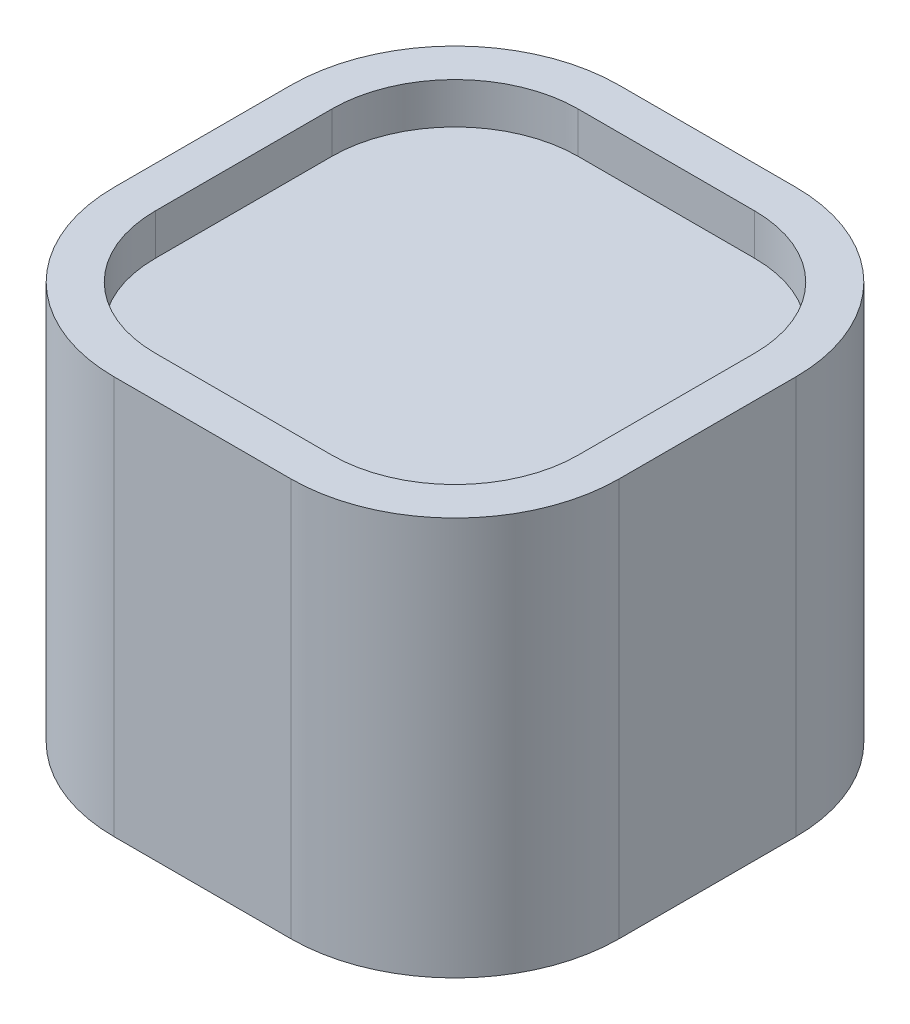
ISO-10303-21;
HEADER;
FILE_DESCRIPTION(('STEP AP214'),'2;1');
FILE_NAME('part.step','',(''),(''),'','','');
FILE_SCHEMA(('AUTOMOTIVE_DESIGN { 1 0 10303 214 1 1 1 1 }'));
ENDSEC;
DATA;
#1=APPLICATION_CONTEXT('core data for automotive mechanical design processes');
#2=APPLICATION_PROTOCOL_DEFINITION('international standard','automotive_design',2000,#1);
#3=PRODUCT_CONTEXT('',#1,'mechanical');
#4=PRODUCT('Part','Part','',(#3));
#5=PRODUCT_RELATED_PRODUCT_CATEGORY('part','',(#4));
#6=PRODUCT_DEFINITION_FORMATION('','',#4);
#7=PRODUCT_DEFINITION_CONTEXT('part definition',#1,'design');
#8=PRODUCT_DEFINITION('design','',#6,#7);
#9=PRODUCT_DEFINITION_SHAPE('','',#8);
#10=(LENGTH_UNIT() NAMED_UNIT(*) SI_UNIT(.MILLI.,.METRE.));
#11=(NAMED_UNIT(*) PLANE_ANGLE_UNIT() SI_UNIT($,.RADIAN.));
#12=(NAMED_UNIT(*) SI_UNIT($,.STERADIAN.) SOLID_ANGLE_UNIT());
#13=UNCERTAINTY_MEASURE_WITH_UNIT(LENGTH_MEASURE(1.E-05),#10,'distance_accuracy_value','');
#14=(GEOMETRIC_REPRESENTATION_CONTEXT(3) GLOBAL_UNCERTAINTY_ASSIGNED_CONTEXT((#13)) GLOBAL_UNIT_ASSIGNED_CONTEXT((#10,
#11,#12)) REPRESENTATION_CONTEXT('',''));
#15=CARTESIAN_POINT('',(0.,0.,0.));
#16=DIRECTION('',(0.,0.,1.));
#17=DIRECTION('',(1.,0.,0.));
#18=AXIS2_PLACEMENT_3D('',#15,#16,#17);
#19=CARTESIAN_POINT('',(-21.5,97.,21.5));
#20=DIRECTION('',(0.,1.,0.));
#21=DIRECTION('',(0.,0.,1.));
#22=AXIS2_PLACEMENT_3D('',#19,#20,#21);
#23=CYLINDRICAL_SURFACE('',#22,40.);
#24=DIRECTION('',(0.,1.,0.));
#25=VECTOR('',#24,1.);
#26=CARTESIAN_POINT('',(-61.5,97.,21.5));
#27=LINE('',#26,#25);
#28=CARTESIAN_POINT('',(-61.5,0.,21.5));
#29=VERTEX_POINT('',#28);
#30=CARTESIAN_POINT('',(-61.5,97.,21.5));
#31=VERTEX_POINT('',#30);
#32=EDGE_CURVE('E268',#29,#31,#27,.T.);
#33=ORIENTED_EDGE('',*,*,#32,.F.);
#34=CARTESIAN_POINT('',(-21.5,0.,21.5));
#35=DIRECTION('',(0.,1.,0.));
#36=DIRECTION('',(0.,0.,1.));
#37=AXIS2_PLACEMENT_3D('',#34,#35,#36);
#38=CIRCLE('',#37,40.);
#39=CARTESIAN_POINT('',(-21.5,0.,61.5));
#40=VERTEX_POINT('',#39);
#41=EDGE_CURVE('E45',#40,#29,#38,.F.);
#42=ORIENTED_EDGE('',*,*,#41,.F.);
#43=DIRECTION('',(0.,1.,0.));
#44=VECTOR('',#43,1.);
#45=CARTESIAN_POINT('',(-21.5,97.,61.5));
#46=LINE('',#45,#44);
#47=CARTESIAN_POINT('',(-21.5,97.,61.5));
#48=VERTEX_POINT('',#47);
#49=EDGE_CURVE('E271',#48,#40,#46,.F.);
#50=ORIENTED_EDGE('',*,*,#49,.F.);
#51=CARTESIAN_POINT('',(-21.5,97.,21.5));
#52=DIRECTION('',(0.,1.,0.));
#53=DIRECTION('',(0.,0.,1.));
#54=AXIS2_PLACEMENT_3D('',#51,#52,#53);
#55=CIRCLE('',#54,40.);
#56=EDGE_CURVE('E11',#31,#48,#55,.T.);
#57=ORIENTED_EDGE('',*,*,#56,.F.);
#58=EDGE_LOOP('',(#33,#42,#50,#57));
#59=FACE_BOUND('',#58,.T.);
#60=ADVANCED_FACE('F38',(#59),#23,.T.);
#61=CARTESIAN_POINT('',(21.5,97.,21.5));
#62=DIRECTION('',(0.,-1.,0.));
#63=DIRECTION('',(0.,0.,-1.));
#64=AXIS2_PLACEMENT_3D('',#61,#62,#63);
#65=CYLINDRICAL_SURFACE('',#64,40.);
#66=DIRECTION('',(0.,-1.,0.));
#67=VECTOR('',#66,1.);
#68=CARTESIAN_POINT('',(61.5,97.,21.5));
#69=LINE('',#68,#67);
#70=CARTESIAN_POINT('',(61.5,97.,21.5));
#71=VERTEX_POINT('',#70);
#72=CARTESIAN_POINT('',(61.5,0.,21.5));
#73=VERTEX_POINT('',#72);
#74=EDGE_CURVE('E257',#71,#73,#69,.T.);
#75=ORIENTED_EDGE('',*,*,#74,.F.);
#76=CARTESIAN_POINT('',(21.5,97.,21.5));
#77=DIRECTION('',(0.,1.,0.));
#78=DIRECTION('',(0.,0.,1.));
#79=AXIS2_PLACEMENT_3D('',#76,#77,#78);
#80=CIRCLE('',#79,40.);
#81=CARTESIAN_POINT('',(21.5,97.,61.5));
#82=VERTEX_POINT('',#81);
#83=EDGE_CURVE('E263',#82,#71,#80,.T.);
#84=ORIENTED_EDGE('',*,*,#83,.F.);
#85=DIRECTION('',(0.,-1.,0.));
#86=VECTOR('',#85,1.);
#87=CARTESIAN_POINT('',(21.5,97.,61.5));
#88=LINE('',#87,#86);
#89=CARTESIAN_POINT('',(21.5,0.,61.5));
#90=VERTEX_POINT('',#89);
#91=EDGE_CURVE('E260',#90,#82,#88,.F.);
#92=ORIENTED_EDGE('',*,*,#91,.F.);
#93=CARTESIAN_POINT('',(21.5,0.,21.5));
#94=DIRECTION('',(0.,1.,0.));
#95=DIRECTION('',(0.,0.,1.));
#96=AXIS2_PLACEMENT_3D('',#93,#94,#95);
#97=CIRCLE('',#96,40.);
#98=EDGE_CURVE('E265',#73,#90,#97,.F.);
#99=ORIENTED_EDGE('',*,*,#98,.F.);
#100=EDGE_LOOP('',(#75,#84,#92,#99));
#101=FACE_BOUND('',#100,.T.);
#102=ADVANCED_FACE('F304',(#101),#65,.T.);
#103=CARTESIAN_POINT('',(21.5,97.,-21.5));
#104=DIRECTION('',(0.,-1.,0.));
#105=DIRECTION('',(0.,0.,-1.));
#106=AXIS2_PLACEMENT_3D('',#103,#104,#105);
#107=CYLINDRICAL_SURFACE('',#106,40.);
#108=DIRECTION('',(0.,-1.,0.));
#109=VECTOR('',#108,1.);
#110=CARTESIAN_POINT('',(21.5,97.,-61.5));
#111=LINE('',#110,#109);
#112=CARTESIAN_POINT('',(21.5,97.,-61.5));
#113=VERTEX_POINT('',#112);
#114=CARTESIAN_POINT('',(21.5,0.,-61.5));
#115=VERTEX_POINT('',#114);
#116=EDGE_CURVE('E246',#113,#115,#111,.T.);
#117=ORIENTED_EDGE('',*,*,#116,.F.);
#118=CARTESIAN_POINT('',(21.5,97.,-21.5));
#119=DIRECTION('',(0.,1.,0.));
#120=DIRECTION('',(0.,0.,1.));
#121=AXIS2_PLACEMENT_3D('',#118,#119,#120);
#122=CIRCLE('',#121,40.);
#123=CARTESIAN_POINT('',(61.5,97.,-21.5));
#124=VERTEX_POINT('',#123);
#125=EDGE_CURVE('E252',#124,#113,#122,.T.);
#126=ORIENTED_EDGE('',*,*,#125,.F.);
#127=DIRECTION('',(0.,-1.,0.));
#128=VECTOR('',#127,1.);
#129=CARTESIAN_POINT('',(61.5,97.,-21.5));
#130=LINE('',#129,#128);
#131=CARTESIAN_POINT('',(61.5,0.,-21.5));
#132=VERTEX_POINT('',#131);
#133=EDGE_CURVE('E249',#132,#124,#130,.F.);
#134=ORIENTED_EDGE('',*,*,#133,.F.);
#135=CARTESIAN_POINT('',(21.5,0.,-21.5));
#136=DIRECTION('',(0.,1.,0.));
#137=DIRECTION('',(0.,0.,1.));
#138=AXIS2_PLACEMENT_3D('',#135,#136,#137);
#139=CIRCLE('',#138,40.);
#140=EDGE_CURVE('E254',#115,#132,#139,.F.);
#141=ORIENTED_EDGE('',*,*,#140,.F.);
#142=EDGE_LOOP('',(#117,#126,#134,#141));
#143=FACE_BOUND('',#142,.T.);
#144=ADVANCED_FACE('F296',(#143),#107,.T.);
#145=CARTESIAN_POINT('',(-21.5,97.,-21.5));
#146=DIRECTION('',(0.,-1.,0.));
#147=DIRECTION('',(0.,0.,-1.));
#148=AXIS2_PLACEMENT_3D('',#145,#146,#147);
#149=CYLINDRICAL_SURFACE('',#148,40.);
#150=DIRECTION('',(0.,-1.,0.));
#151=VECTOR('',#150,1.);
#152=CARTESIAN_POINT('',(-61.5,97.,-21.5));
#153=LINE('',#152,#151);
#154=CARTESIAN_POINT('',(-61.5,97.,-21.5));
#155=VERTEX_POINT('',#154);
#156=CARTESIAN_POINT('',(-61.5,0.,-21.5));
#157=VERTEX_POINT('',#156);
#158=EDGE_CURVE('E228',#155,#157,#153,.T.);
#159=ORIENTED_EDGE('',*,*,#158,.F.);
#160=CARTESIAN_POINT('',(-21.5,97.,-21.5));
#161=DIRECTION('',(0.,1.,0.));
#162=DIRECTION('',(0.,0.,1.));
#163=AXIS2_PLACEMENT_3D('',#160,#161,#162);
#164=CIRCLE('',#163,40.);
#165=CARTESIAN_POINT('',(-21.5,97.,-61.5));
#166=VERTEX_POINT('',#165);
#167=EDGE_CURVE('E241',#166,#155,#164,.T.);
#168=ORIENTED_EDGE('',*,*,#167,.F.);
#169=DIRECTION('',(0.,-1.,0.));
#170=VECTOR('',#169,1.);
#171=CARTESIAN_POINT('',(-21.5,97.,-61.5));
#172=LINE('',#171,#170);
#173=CARTESIAN_POINT('',(-21.5,0.,-61.5));
#174=VERTEX_POINT('',#173);
#175=EDGE_CURVE('E238',#174,#166,#172,.F.);
#176=ORIENTED_EDGE('',*,*,#175,.F.);
#177=CARTESIAN_POINT('',(-21.5,0.,-21.5));
#178=DIRECTION('',(0.,1.,0.));
#179=DIRECTION('',(0.,0.,1.));
#180=AXIS2_PLACEMENT_3D('',#177,#178,#179);
#181=CIRCLE('',#180,40.);
#182=EDGE_CURVE('E243',#157,#174,#181,.F.);
#183=ORIENTED_EDGE('',*,*,#182,.F.);
#184=EDGE_LOOP('',(#159,#168,#176,#183));
#185=FACE_BOUND('',#184,.T.);
#186=ADVANCED_FACE('F285',(#185),#149,.T.);
#187=CARTESIAN_POINT('',(61.5,97.,-61.5));
#188=DIRECTION('',(-1.,0.,0.));
#189=DIRECTION('',(0.,0.,1.));
#190=AXIS2_PLACEMENT_3D('',#187,#188,#189);
#191=PLANE('',#190);
#192=DIRECTION('',(0.,0.,-1.));
#193=VECTOR('',#192,1.);
#194=CARTESIAN_POINT('',(61.5,97.,-61.5));
#195=LINE('',#194,#193);
#196=EDGE_CURVE('E219',#71,#124,#195,.T.);
#197=ORIENTED_EDGE('',*,*,#196,.F.);
#198=ORIENTED_EDGE('',*,*,#74,.T.);
#199=DIRECTION('',(0.,0.,-1.));
#200=VECTOR('',#199,1.);
#201=CARTESIAN_POINT('',(61.5,0.,-61.5));
#202=LINE('',#201,#200);
#203=EDGE_CURVE('E207',#73,#132,#202,.T.);
#204=ORIENTED_EDGE('',*,*,#203,.T.);
#205=ORIENTED_EDGE('',*,*,#133,.T.);
#206=EDGE_LOOP('',(#197,#198,#204,#205));
#207=FACE_BOUND('',#206,.T.);
#208=ADVANCED_FACE('F299',(#207),#191,.F.);
#209=CARTESIAN_POINT('',(-61.5,97.,-61.5));
#210=DIRECTION('',(0.,0.,1.));
#211=DIRECTION('',(1.,0.,0.));
#212=AXIS2_PLACEMENT_3D('',#209,#210,#211);
#213=PLANE('',#212);
#214=DIRECTION('',(-1.,0.,0.));
#215=VECTOR('',#214,1.);
#216=CARTESIAN_POINT('',(-61.5,97.,-61.5));
#217=LINE('',#216,#215);
#218=EDGE_CURVE('E221',#113,#166,#217,.T.);
#219=ORIENTED_EDGE('',*,*,#218,.F.);
#220=ORIENTED_EDGE('',*,*,#116,.T.);
#221=DIRECTION('',(-1.,0.,0.));
#222=VECTOR('',#221,1.);
#223=CARTESIAN_POINT('',(-61.5,0.,-61.5));
#224=LINE('',#223,#222);
#225=EDGE_CURVE('E230',#115,#174,#224,.T.);
#226=ORIENTED_EDGE('',*,*,#225,.T.);
#227=ORIENTED_EDGE('',*,*,#175,.T.);
#228=EDGE_LOOP('',(#219,#220,#226,#227));
#229=FACE_BOUND('',#228,.T.);
#230=ADVANCED_FACE('F292',(#229),#213,.F.);
#231=CARTESIAN_POINT('',(-61.5,97.,-61.5));
#232=DIRECTION('',(1.,0.,0.));
#233=DIRECTION('',(0.,0.,-1.));
#234=AXIS2_PLACEMENT_3D('',#231,#232,#233);
#235=PLANE('',#234);
#236=DIRECTION('',(0.,0.,1.));
#237=VECTOR('',#236,1.);
#238=CARTESIAN_POINT('',(-61.5,0.,-61.5));
#239=LINE('',#238,#237);
#240=EDGE_CURVE('E232',#157,#29,#239,.T.);
#241=ORIENTED_EDGE('',*,*,#240,.T.);
#242=ORIENTED_EDGE('',*,*,#32,.T.);
#243=DIRECTION('',(0.,0.,1.));
#244=VECTOR('',#243,1.);
#245=CARTESIAN_POINT('',(-61.5,97.,-61.5));
#246=LINE('',#245,#244);
#247=EDGE_CURVE('E224',#155,#31,#246,.T.);
#248=ORIENTED_EDGE('',*,*,#247,.F.);
#249=ORIENTED_EDGE('',*,*,#158,.T.);
#250=EDGE_LOOP('',(#241,#242,#248,#249));
#251=FACE_BOUND('',#250,.T.);
#252=ADVANCED_FACE('F281',(#251),#235,.F.);
#253=CARTESIAN_POINT('',(-61.5,97.,61.5));
#254=DIRECTION('',(0.,0.,-1.));
#255=DIRECTION('',(-1.,0.,0.));
#256=AXIS2_PLACEMENT_3D('',#253,#254,#255);
#257=PLANE('',#256);
#258=DIRECTION('',(1.,0.,0.));
#259=VECTOR('',#258,1.);
#260=CARTESIAN_POINT('',(-61.5,97.,61.5));
#261=LINE('',#260,#259);
#262=EDGE_CURVE('E226',#48,#82,#261,.T.);
#263=ORIENTED_EDGE('',*,*,#262,.F.);
#264=ORIENTED_EDGE('',*,*,#49,.T.);
#265=DIRECTION('',(1.,0.,0.));
#266=VECTOR('',#265,1.);
#267=CARTESIAN_POINT('',(-61.5,0.,61.5));
#268=LINE('',#267,#266);
#269=EDGE_CURVE('E222',#40,#90,#268,.T.);
#270=ORIENTED_EDGE('',*,*,#269,.T.);
#271=ORIENTED_EDGE('',*,*,#91,.T.);
#272=EDGE_LOOP('',(#263,#264,#270,#271));
#273=FACE_BOUND('',#272,.T.);
#274=ADVANCED_FACE('F307',(#273),#257,.F.);
#275=CARTESIAN_POINT('',(0.,97.,0.));
#276=DIRECTION('',(0.,1.,0.));
#277=DIRECTION('',(0.,0.,1.));
#278=AXIS2_PLACEMENT_3D('',#275,#276,#277);
#279=PLANE('',#278);
#280=DIRECTION('',(-1.,0.,0.));
#281=VECTOR('',#280,1.);
#282=CARTESIAN_POINT('',(0.,97.,-51.5));
#283=LINE('',#282,#281);
#284=CARTESIAN_POINT('',(21.5,97.,-51.5));
#285=VERTEX_POINT('',#284);
#286=CARTESIAN_POINT('',(-21.5,97.,-51.5));
#287=VERTEX_POINT('',#286);
#288=EDGE_CURVE('E52',#285,#287,#283,.T.);
#289=ORIENTED_EDGE('',*,*,#288,.F.);
#290=CARTESIAN_POINT('',(21.5,97.,-21.5));
#291=DIRECTION('',(0.,1.,0.));
#292=DIRECTION('',(0.,0.,1.));
#293=AXIS2_PLACEMENT_3D('',#290,#291,#292);
#294=CIRCLE('',#293,30.);
#295=CARTESIAN_POINT('',(51.5,97.,-21.5));
#296=VERTEX_POINT('',#295);
#297=EDGE_CURVE('E169',#296,#285,#294,.T.);
#298=ORIENTED_EDGE('',*,*,#297,.F.);
#299=DIRECTION('',(0.,0.,-1.));
#300=VECTOR('',#299,1.);
#301=CARTESIAN_POINT('',(51.5,97.,0.));
#302=LINE('',#301,#300);
#303=CARTESIAN_POINT('',(51.5,97.,21.5));
#304=VERTEX_POINT('',#303);
#305=EDGE_CURVE('E172',#304,#296,#302,.T.);
#306=ORIENTED_EDGE('',*,*,#305,.F.);
#307=CARTESIAN_POINT('',(21.5,97.,21.5));
#308=DIRECTION('',(0.,1.,0.));
#309=DIRECTION('',(0.,0.,1.));
#310=AXIS2_PLACEMENT_3D('',#307,#308,#309);
#311=CIRCLE('',#310,30.);
#312=CARTESIAN_POINT('',(21.5,97.,51.5));
#313=VERTEX_POINT('',#312);
#314=EDGE_CURVE('E200',#313,#304,#311,.T.);
#315=ORIENTED_EDGE('',*,*,#314,.F.);
#316=DIRECTION('',(1.,0.,0.));
#317=VECTOR('',#316,1.);
#318=CARTESIAN_POINT('',(0.,97.,51.5));
#319=LINE('',#318,#317);
#320=CARTESIAN_POINT('',(-21.5,97.,51.5));
#321=VERTEX_POINT('',#320);
#322=EDGE_CURVE('E197',#321,#313,#319,.T.);
#323=ORIENTED_EDGE('',*,*,#322,.F.);
#324=CARTESIAN_POINT('',(-21.5,97.,21.5));
#325=DIRECTION('',(0.,1.,0.));
#326=DIRECTION('',(0.,0.,1.));
#327=AXIS2_PLACEMENT_3D('',#324,#325,#326);
#328=CIRCLE('',#327,30.);
#329=CARTESIAN_POINT('',(-51.5,97.,21.5));
#330=VERTEX_POINT('',#329);
#331=EDGE_CURVE('E194',#330,#321,#328,.T.);
#332=ORIENTED_EDGE('',*,*,#331,.F.);
#333=DIRECTION('',(0.,0.,1.));
#334=VECTOR('',#333,1.);
#335=CARTESIAN_POINT('',(-51.5,97.,0.));
#336=LINE('',#335,#334);
#337=CARTESIAN_POINT('',(-51.5,97.,-21.5));
#338=VERTEX_POINT('',#337);
#339=EDGE_CURVE('E191',#338,#330,#336,.T.);
#340=ORIENTED_EDGE('',*,*,#339,.F.);
#341=CARTESIAN_POINT('',(-21.5,97.,-21.5));
#342=DIRECTION('',(0.,1.,0.));
#343=DIRECTION('',(0.,0.,1.));
#344=AXIS2_PLACEMENT_3D('',#341,#342,#343);
#345=CIRCLE('',#344,30.);
#346=EDGE_CURVE('E189',#287,#338,#345,.T.);
#347=ORIENTED_EDGE('',*,*,#346,.F.);
#348=EDGE_LOOP('',(#289,#298,#306,#315,#323,#332,#340,#347));
#349=FACE_BOUND('',#348,.T.);
#350=ORIENTED_EDGE('',*,*,#247,.T.);
#351=ORIENTED_EDGE('',*,*,#56,.T.);
#352=ORIENTED_EDGE('',*,*,#262,.T.);
#353=ORIENTED_EDGE('',*,*,#83,.T.);
#354=ORIENTED_EDGE('',*,*,#196,.T.);
#355=ORIENTED_EDGE('',*,*,#125,.T.);
#356=ORIENTED_EDGE('',*,*,#218,.T.);
#357=ORIENTED_EDGE('',*,*,#167,.T.);
#358=EDGE_LOOP('',(#350,#351,#352,#353,#354,#355,#356,#357));
#359=FACE_BOUND('',#358,.T.);
#360=ADVANCED_FACE('F308',(#349,#359),#279,.T.);
#361=CARTESIAN_POINT('',(0.,0.,0.));
#362=DIRECTION('',(0.,1.,0.));
#363=DIRECTION('',(0.,0.,1.));
#364=AXIS2_PLACEMENT_3D('',#361,#362,#363);
#365=PLANE('',#364);
#366=ORIENTED_EDGE('',*,*,#269,.F.);
#367=ORIENTED_EDGE('',*,*,#41,.T.);
#368=ORIENTED_EDGE('',*,*,#240,.F.);
#369=ORIENTED_EDGE('',*,*,#182,.T.);
#370=ORIENTED_EDGE('',*,*,#225,.F.);
#371=ORIENTED_EDGE('',*,*,#140,.T.);
#372=ORIENTED_EDGE('',*,*,#203,.F.);
#373=ORIENTED_EDGE('',*,*,#98,.T.);
#374=EDGE_LOOP('',(#366,#367,#368,#369,#370,#371,#372,#373));
#375=FACE_BOUND('',#374,.T.);
#376=ADVANCED_FACE('F277',(#375),#365,.F.);
#377=CARTESIAN_POINT('',(0.,87.,-51.5));
#378=DIRECTION('',(0.,0.,-1.));
#379=DIRECTION('',(-1.,0.,0.));
#380=AXIS2_PLACEMENT_3D('',#377,#378,#379);
#381=PLANE('',#380);
#382=ORIENTED_EDGE('',*,*,#288,.T.);
#383=DIRECTION('',(0.,1.,0.));
#384=VECTOR('',#383,1.);
#385=CARTESIAN_POINT('',(-21.5,87.,-51.5));
#386=LINE('',#385,#384);
#387=CARTESIAN_POINT('',(-21.5,87.,-51.5));
#388=VERTEX_POINT('',#387);
#389=EDGE_CURVE('E146',#388,#287,#386,.T.);
#390=ORIENTED_EDGE('',*,*,#389,.F.);
#391=DIRECTION('',(-1.,0.,0.));
#392=VECTOR('',#391,1.);
#393=CARTESIAN_POINT('',(0.,87.,-51.5));
#394=LINE('',#393,#392);
#395=CARTESIAN_POINT('',(21.5,87.,-51.5));
#396=VERTEX_POINT('',#395);
#397=EDGE_CURVE('E150',#396,#388,#394,.T.);
#398=ORIENTED_EDGE('',*,*,#397,.F.);
#399=DIRECTION('',(0.,1.,0.));
#400=VECTOR('',#399,1.);
#401=CARTESIAN_POINT('',(21.5,87.,-51.5));
#402=LINE('',#401,#400);
#403=EDGE_CURVE('E205',#396,#285,#402,.T.);
#404=ORIENTED_EDGE('',*,*,#403,.T.);
#405=EDGE_LOOP('',(#382,#390,#398,#404));
#406=FACE_BOUND('',#405,.T.);
#407=ADVANCED_FACE('F148',(#406),#381,.F.);
#408=CARTESIAN_POINT('',(21.5,87.,-21.5));
#409=DIRECTION('',(0.,1.,0.));
#410=DIRECTION('',(0.,0.,1.));
#411=AXIS2_PLACEMENT_3D('',#408,#409,#410);
#412=CYLINDRICAL_SURFACE('',#411,30.);
#413=ORIENTED_EDGE('',*,*,#297,.T.);
#414=ORIENTED_EDGE('',*,*,#403,.F.);
#415=CARTESIAN_POINT('',(21.5,87.,-21.5));
#416=DIRECTION('',(0.,1.,0.));
#417=DIRECTION('',(0.,0.,1.));
#418=AXIS2_PLACEMENT_3D('',#415,#416,#417);
#419=CIRCLE('',#418,30.);
#420=CARTESIAN_POINT('',(51.5,87.,-21.5));
#421=VERTEX_POINT('',#420);
#422=EDGE_CURVE('E156',#421,#396,#419,.T.);
#423=ORIENTED_EDGE('',*,*,#422,.F.);
#424=DIRECTION('',(0.,1.,0.));
#425=VECTOR('',#424,1.);
#426=CARTESIAN_POINT('',(51.5,87.,-21.5));
#427=LINE('',#426,#425);
#428=EDGE_CURVE('E208',#421,#296,#427,.T.);
#429=ORIENTED_EDGE('',*,*,#428,.T.);
#430=EDGE_LOOP('',(#413,#414,#423,#429));
#431=FACE_BOUND('',#430,.T.);
#432=ADVANCED_FACE('F366',(#431),#412,.F.);
#433=CARTESIAN_POINT('',(51.5,87.,0.));
#434=DIRECTION('',(1.,0.,0.));
#435=DIRECTION('',(0.,0.,-1.));
#436=AXIS2_PLACEMENT_3D('',#433,#434,#435);
#437=PLANE('',#436);
#438=ORIENTED_EDGE('',*,*,#305,.T.);
#439=ORIENTED_EDGE('',*,*,#428,.F.);
#440=DIRECTION('',(0.,0.,-1.));
#441=VECTOR('',#440,1.);
#442=CARTESIAN_POINT('',(51.5,87.,0.));
#443=LINE('',#442,#441);
#444=CARTESIAN_POINT('',(51.5,87.,21.5));
#445=VERTEX_POINT('',#444);
#446=EDGE_CURVE('E185',#445,#421,#443,.T.);
#447=ORIENTED_EDGE('',*,*,#446,.F.);
#448=DIRECTION('',(0.,1.,0.));
#449=VECTOR('',#448,1.);
#450=CARTESIAN_POINT('',(51.5,87.,21.5));
#451=LINE('',#450,#449);
#452=EDGE_CURVE('E210',#445,#304,#451,.T.);
#453=ORIENTED_EDGE('',*,*,#452,.T.);
#454=EDGE_LOOP('',(#438,#439,#447,#453));
#455=FACE_BOUND('',#454,.T.);
#456=ADVANCED_FACE('F376',(#455),#437,.F.);
#457=CARTESIAN_POINT('',(21.5,87.,21.5));
#458=DIRECTION('',(0.,1.,0.));
#459=DIRECTION('',(0.,0.,1.));
#460=AXIS2_PLACEMENT_3D('',#457,#458,#459);
#461=CYLINDRICAL_SURFACE('',#460,30.);
#462=ORIENTED_EDGE('',*,*,#314,.T.);
#463=ORIENTED_EDGE('',*,*,#452,.F.);
#464=CARTESIAN_POINT('',(21.5,87.,21.5));
#465=DIRECTION('',(0.,1.,0.));
#466=DIRECTION('',(0.,0.,1.));
#467=AXIS2_PLACEMENT_3D('',#464,#465,#466);
#468=CIRCLE('',#467,30.);
#469=CARTESIAN_POINT('',(21.5,87.,51.5));
#470=VERTEX_POINT('',#469);
#471=EDGE_CURVE('E182',#470,#445,#468,.T.);
#472=ORIENTED_EDGE('',*,*,#471,.F.);
#473=DIRECTION('',(0.,1.,0.));
#474=VECTOR('',#473,1.);
#475=CARTESIAN_POINT('',(21.5,87.,51.5));
#476=LINE('',#475,#474);
#477=EDGE_CURVE('E212',#470,#313,#476,.T.);
#478=ORIENTED_EDGE('',*,*,#477,.T.);
#479=EDGE_LOOP('',(#462,#463,#472,#478));
#480=FACE_BOUND('',#479,.T.);
#481=ADVANCED_FACE('F387',(#480),#461,.F.);
#482=CARTESIAN_POINT('',(0.,87.,51.5));
#483=DIRECTION('',(0.,0.,1.));
#484=DIRECTION('',(1.,0.,0.));
#485=AXIS2_PLACEMENT_3D('',#482,#483,#484);
#486=PLANE('',#485);
#487=ORIENTED_EDGE('',*,*,#322,.T.);
#488=ORIENTED_EDGE('',*,*,#477,.F.);
#489=DIRECTION('',(1.,0.,0.));
#490=VECTOR('',#489,1.);
#491=CARTESIAN_POINT('',(0.,87.,51.5));
#492=LINE('',#491,#490);
#493=CARTESIAN_POINT('',(-21.5,87.,51.5));
#494=VERTEX_POINT('',#493);
#495=EDGE_CURVE('E179',#494,#470,#492,.T.);
#496=ORIENTED_EDGE('',*,*,#495,.F.);
#497=DIRECTION('',(0.,1.,0.));
#498=VECTOR('',#497,1.);
#499=CARTESIAN_POINT('',(-21.5,87.,51.5));
#500=LINE('',#499,#498);
#501=EDGE_CURVE('E214',#494,#321,#500,.T.);
#502=ORIENTED_EDGE('',*,*,#501,.T.);
#503=EDGE_LOOP('',(#487,#488,#496,#502));
#504=FACE_BOUND('',#503,.T.);
#505=ADVANCED_FACE('F398',(#504),#486,.F.);
#506=CARTESIAN_POINT('',(-21.5,87.,21.5));
#507=DIRECTION('',(0.,1.,0.));
#508=DIRECTION('',(0.,0.,1.));
#509=AXIS2_PLACEMENT_3D('',#506,#507,#508);
#510=CYLINDRICAL_SURFACE('',#509,30.);
#511=ORIENTED_EDGE('',*,*,#331,.T.);
#512=ORIENTED_EDGE('',*,*,#501,.F.);
#513=CARTESIAN_POINT('',(-21.5,87.,21.5));
#514=DIRECTION('',(0.,1.,0.));
#515=DIRECTION('',(0.,0.,1.));
#516=AXIS2_PLACEMENT_3D('',#513,#514,#515);
#517=CIRCLE('',#516,30.);
#518=CARTESIAN_POINT('',(-51.5,87.,21.5));
#519=VERTEX_POINT('',#518);
#520=EDGE_CURVE('E176',#519,#494,#517,.T.);
#521=ORIENTED_EDGE('',*,*,#520,.F.);
#522=DIRECTION('',(0.,1.,0.));
#523=VECTOR('',#522,1.);
#524=CARTESIAN_POINT('',(-51.5,87.,21.5));
#525=LINE('',#524,#523);
#526=EDGE_CURVE('E216',#519,#330,#525,.T.);
#527=ORIENTED_EDGE('',*,*,#526,.T.);
#528=EDGE_LOOP('',(#511,#512,#521,#527));
#529=FACE_BOUND('',#528,.T.);
#530=ADVANCED_FACE('F409',(#529),#510,.F.);
#531=CARTESIAN_POINT('',(-51.5,87.,0.));
#532=DIRECTION('',(-1.,0.,0.));
#533=DIRECTION('',(0.,0.,1.));
#534=AXIS2_PLACEMENT_3D('',#531,#532,#533);
#535=PLANE('',#534);
#536=ORIENTED_EDGE('',*,*,#339,.T.);
#537=ORIENTED_EDGE('',*,*,#526,.F.);
#538=DIRECTION('',(0.,0.,1.));
#539=VECTOR('',#538,1.);
#540=CARTESIAN_POINT('',(-51.5,87.,0.));
#541=LINE('',#540,#539);
#542=CARTESIAN_POINT('',(-51.5,87.,-21.5));
#543=VERTEX_POINT('',#542);
#544=EDGE_CURVE('E164',#543,#519,#541,.T.);
#545=ORIENTED_EDGE('',*,*,#544,.F.);
#546=DIRECTION('',(0.,1.,0.));
#547=VECTOR('',#546,1.);
#548=CARTESIAN_POINT('',(-51.5,87.,-21.5));
#549=LINE('',#548,#547);
#550=EDGE_CURVE('E155',#543,#338,#549,.T.);
#551=ORIENTED_EDGE('',*,*,#550,.T.);
#552=EDGE_LOOP('',(#536,#537,#545,#551));
#553=FACE_BOUND('',#552,.T.);
#554=ADVANCED_FACE('F420',(#553),#535,.F.);
#555=CARTESIAN_POINT('',(-21.5,87.,-21.5));
#556=DIRECTION('',(0.,1.,0.));
#557=DIRECTION('',(0.,0.,1.));
#558=AXIS2_PLACEMENT_3D('',#555,#556,#557);
#559=CYLINDRICAL_SURFACE('',#558,30.);
#560=ORIENTED_EDGE('',*,*,#346,.T.);
#561=ORIENTED_EDGE('',*,*,#550,.F.);
#562=CARTESIAN_POINT('',(-21.5,87.,-21.5));
#563=DIRECTION('',(0.,1.,0.));
#564=DIRECTION('',(0.,0.,1.));
#565=AXIS2_PLACEMENT_3D('',#562,#563,#564);
#566=CIRCLE('',#565,30.);
#567=EDGE_CURVE('E159',#388,#543,#566,.T.);
#568=ORIENTED_EDGE('',*,*,#567,.F.);
#569=ORIENTED_EDGE('',*,*,#389,.T.);
#570=EDGE_LOOP('',(#560,#561,#568,#569));
#571=FACE_BOUND('',#570,.T.);
#572=ADVANCED_FACE('F160',(#571),#559,.F.);
#573=CARTESIAN_POINT('',(0.,87.,0.));
#574=DIRECTION('',(0.,1.,0.));
#575=DIRECTION('',(0.,0.,1.));
#576=AXIS2_PLACEMENT_3D('',#573,#574,#575);
#577=PLANE('',#576);
#578=ORIENTED_EDGE('',*,*,#397,.T.);
#579=ORIENTED_EDGE('',*,*,#567,.T.);
#580=ORIENTED_EDGE('',*,*,#544,.T.);
#581=ORIENTED_EDGE('',*,*,#520,.T.);
#582=ORIENTED_EDGE('',*,*,#495,.T.);
#583=ORIENTED_EDGE('',*,*,#471,.T.);
#584=ORIENTED_EDGE('',*,*,#446,.T.);
#585=ORIENTED_EDGE('',*,*,#422,.T.);
#586=EDGE_LOOP('',(#578,#579,#580,#581,#582,#583,#584,#585));
#587=FACE_BOUND('',#586,.T.);
#588=ADVANCED_FACE('F166',(#587),#577,.T.);
#589=CLOSED_SHELL('',(#60,#102,#144,#186,#208,#230,#252,#274,#360,#376,#407,#432,#456,#481,#505,
#530,#554,#572,#588));
#590=MANIFOLD_SOLID_BREP('B2',#589);
#591=ADVANCED_BREP_SHAPE_REPRESENTATION('',(#18,#590),#14);
#592=SHAPE_DEFINITION_REPRESENTATION(#9,#591);
ENDSEC;
END-ISO-10303-21;
